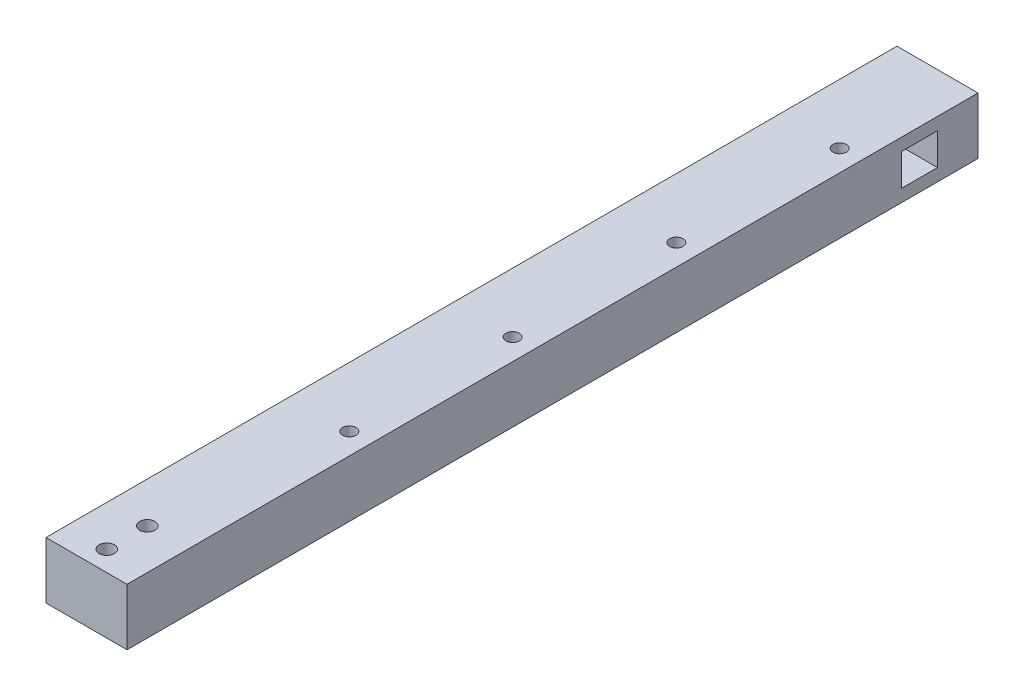
ISO-10303-21;
HEADER;
FILE_DESCRIPTION(('STEP AP214'),'2;1');
FILE_NAME('part.step','',(''),(''),'','','');
FILE_SCHEMA(('AUTOMOTIVE_DESIGN { 1 0 10303 214 1 1 1 1 }'));
ENDSEC;
DATA;
#1=APPLICATION_CONTEXT('core data for automotive mechanical design processes');
#2=APPLICATION_PROTOCOL_DEFINITION('international standard','automotive_design',2000,#1);
#3=PRODUCT_CONTEXT('',#1,'mechanical');
#4=PRODUCT('Part','Part','',(#3));
#5=PRODUCT_RELATED_PRODUCT_CATEGORY('part','',(#4));
#6=PRODUCT_DEFINITION_FORMATION('','',#4);
#7=PRODUCT_DEFINITION_CONTEXT('part definition',#1,'design');
#8=PRODUCT_DEFINITION('design','',#6,#7);
#9=PRODUCT_DEFINITION_SHAPE('','',#8);
#10=(LENGTH_UNIT() NAMED_UNIT(*) SI_UNIT(.MILLI.,.METRE.));
#11=(NAMED_UNIT(*) PLANE_ANGLE_UNIT() SI_UNIT($,.RADIAN.));
#12=(NAMED_UNIT(*) SI_UNIT($,.STERADIAN.) SOLID_ANGLE_UNIT());
#13=UNCERTAINTY_MEASURE_WITH_UNIT(LENGTH_MEASURE(1.E-05),#10,'distance_accuracy_value','');
#14=(GEOMETRIC_REPRESENTATION_CONTEXT(3) GLOBAL_UNCERTAINTY_ASSIGNED_CONTEXT((#13)) GLOBAL_UNIT_ASSIGNED_CONTEXT((#10,
#11,#12)) REPRESENTATION_CONTEXT('',''));
#15=CARTESIAN_POINT('',(0.,0.,0.));
#16=DIRECTION('',(0.,0.,1.));
#17=DIRECTION('',(1.,0.,0.));
#18=AXIS2_PLACEMENT_3D('',#15,#16,#17);
#19=CARTESIAN_POINT('',(6.35,4.445,66.675));
#20=DIRECTION('',(-1.,0.,0.));
#21=DIRECTION('',(0.,0.,1.));
#22=AXIS2_PLACEMENT_3D('',#19,#20,#21);
#23=PLANE('',#22);
#24=DIRECTION('',(0.,0.,1.));
#25=VECTOR('',#24,1.);
#26=CARTESIAN_POINT('',(6.35,2.5,-54.675));
#27=LINE('',#26,#25);
#28=CARTESIAN_POINT('',(6.35,2.5,-60.325));
#29=VERTEX_POINT('',#28);
#30=CARTESIAN_POINT('',(6.35,2.5,-54.675));
#31=VERTEX_POINT('',#30);
#32=EDGE_CURVE('E150',#29,#31,#27,.T.);
#33=ORIENTED_EDGE('',*,*,#32,.F.);
#34=DIRECTION('',(0.,1.,0.));
#35=VECTOR('',#34,1.);
#36=CARTESIAN_POINT('',(6.35,2.5,-60.325));
#37=LINE('',#36,#35);
#38=CARTESIAN_POINT('',(6.35,-2.5,-60.325));
#39=VERTEX_POINT('',#38);
#40=EDGE_CURVE('E62',#39,#29,#37,.T.);
#41=ORIENTED_EDGE('',*,*,#40,.F.);
#42=DIRECTION('',(0.,0.,-1.));
#43=VECTOR('',#42,1.);
#44=CARTESIAN_POINT('',(6.35,-2.5,-54.675));
#45=LINE('',#44,#43);
#46=CARTESIAN_POINT('',(6.35,-2.5,-54.675));
#47=VERTEX_POINT('',#46);
#48=EDGE_CURVE('E134',#47,#39,#45,.T.);
#49=ORIENTED_EDGE('',*,*,#48,.F.);
#50=DIRECTION('',(0.,-1.,0.));
#51=VECTOR('',#50,1.);
#52=CARTESIAN_POINT('',(6.35,2.5,-54.675));
#53=LINE('',#52,#51);
#54=EDGE_CURVE('E138',#31,#47,#53,.T.);
#55=ORIENTED_EDGE('',*,*,#54,.F.);
#56=EDGE_LOOP('',(#33,#41,#49,#55));
#57=FACE_BOUND('',#56,.T.);
#58=DIRECTION('',(0.,0.,-1.));
#59=VECTOR('',#58,1.);
#60=CARTESIAN_POINT('',(6.35,-4.445,66.675));
#61=LINE('',#60,#59);
#62=CARTESIAN_POINT('',(6.35,-4.445,66.675));
#63=VERTEX_POINT('',#62);
#64=CARTESIAN_POINT('',(6.35,-4.445,-66.675));
#65=VERTEX_POINT('',#64);
#66=EDGE_CURVE('E193',#63,#65,#61,.T.);
#67=ORIENTED_EDGE('',*,*,#66,.T.);
#68=DIRECTION('',(0.,-1.,0.));
#69=VECTOR('',#68,1.);
#70=CARTESIAN_POINT('',(6.35,4.445,-66.675));
#71=LINE('',#70,#69);
#72=CARTESIAN_POINT('',(6.35,4.445,-66.675));
#73=VERTEX_POINT('',#72);
#74=EDGE_CURVE('E11',#73,#65,#71,.T.);
#75=ORIENTED_EDGE('',*,*,#74,.F.);
#76=DIRECTION('',(0.,0.,-1.));
#77=VECTOR('',#76,1.);
#78=CARTESIAN_POINT('',(6.35,4.445,66.675));
#79=LINE('',#78,#77);
#80=CARTESIAN_POINT('',(6.35,4.445,66.675));
#81=VERTEX_POINT('',#80);
#82=EDGE_CURVE('E178',#81,#73,#79,.T.);
#83=ORIENTED_EDGE('',*,*,#82,.F.);
#84=DIRECTION('',(0.,-1.,0.));
#85=VECTOR('',#84,1.);
#86=CARTESIAN_POINT('',(6.35,4.445,66.675));
#87=LINE('',#86,#85);
#88=EDGE_CURVE('E192',#81,#63,#87,.T.);
#89=ORIENTED_EDGE('',*,*,#88,.T.);
#90=EDGE_LOOP('',(#67,#75,#83,#89));
#91=FACE_BOUND('',#90,.T.);
#92=ADVANCED_FACE('F45',(#57,#91),#23,.F.);
#93=CARTESIAN_POINT('',(-6.35,4.445,-66.675));
#94=DIRECTION('',(0.,0.,1.));
#95=DIRECTION('',(1.,0.,0.));
#96=AXIS2_PLACEMENT_3D('',#93,#94,#95);
#97=PLANE('',#96);
#98=CARTESIAN_POINT('',(0.,0.,-66.675));
#99=DIRECTION('',(0.,0.,-1.));
#100=DIRECTION('',(-1.,0.,0.));
#101=AXIS2_PLACEMENT_3D('',#98,#99,#100);
#102=CIRCLE('',#101,1.2);
#103=CARTESIAN_POINT('',(-1.2,0.,-66.675));
#104=VERTEX_POINT('',#103);
#105=EDGE_CURVE('E165',#104,#104,#102,.T.);
#106=ORIENTED_EDGE('',*,*,#105,.F.);
#107=EDGE_LOOP('',(#106));
#108=FACE_BOUND('',#107,.T.);
#109=DIRECTION('',(-1.,0.,0.));
#110=VECTOR('',#109,1.);
#111=CARTESIAN_POINT('',(-6.35,-4.445,-66.675));
#112=LINE('',#111,#110);
#113=CARTESIAN_POINT('',(-6.35,-4.445,-66.675));
#114=VERTEX_POINT('',#113);
#115=EDGE_CURVE('E197',#65,#114,#112,.T.);
#116=ORIENTED_EDGE('',*,*,#115,.T.);
#117=DIRECTION('',(0.,-1.,0.));
#118=VECTOR('',#117,1.);
#119=CARTESIAN_POINT('',(-6.35,4.445,-66.675));
#120=LINE('',#119,#118);
#121=CARTESIAN_POINT('',(-6.35,4.445,-66.675));
#122=VERTEX_POINT('',#121);
#123=EDGE_CURVE('E54',#122,#114,#120,.T.);
#124=ORIENTED_EDGE('',*,*,#123,.F.);
#125=DIRECTION('',(-1.,0.,0.));
#126=VECTOR('',#125,1.);
#127=CARTESIAN_POINT('',(-6.35,4.445,-66.675));
#128=LINE('',#127,#126);
#129=EDGE_CURVE('E182',#73,#122,#128,.T.);
#130=ORIENTED_EDGE('',*,*,#129,.F.);
#131=ORIENTED_EDGE('',*,*,#74,.T.);
#132=EDGE_LOOP('',(#116,#124,#130,#131));
#133=FACE_BOUND('',#132,.T.);
#134=ADVANCED_FACE('F248',(#108,#133),#97,.F.);
#135=CARTESIAN_POINT('',(-6.35,4.445,66.675));
#136=DIRECTION('',(1.,0.,0.));
#137=DIRECTION('',(0.,0.,-1.));
#138=AXIS2_PLACEMENT_3D('',#135,#136,#137);
#139=PLANE('',#138);
#140=DIRECTION('',(0.,0.,-1.));
#141=VECTOR('',#140,1.);
#142=CARTESIAN_POINT('',(-6.35,-2.5,-54.675));
#143=LINE('',#142,#141);
#144=CARTESIAN_POINT('',(-6.35,-2.5,-54.675));
#145=VERTEX_POINT('',#144);
#146=CARTESIAN_POINT('',(-6.35,-2.5,-60.325));
#147=VERTEX_POINT('',#146);
#148=EDGE_CURVE('E122',#145,#147,#143,.T.);
#149=ORIENTED_EDGE('',*,*,#148,.T.);
#150=DIRECTION('',(0.,1.,0.));
#151=VECTOR('',#150,1.);
#152=CARTESIAN_POINT('',(-6.35,2.5,-60.325));
#153=LINE('',#152,#151);
#154=CARTESIAN_POINT('',(-6.35,2.5,-60.325));
#155=VERTEX_POINT('',#154);
#156=EDGE_CURVE('E115',#147,#155,#153,.T.);
#157=ORIENTED_EDGE('',*,*,#156,.T.);
#158=DIRECTION('',(0.,0.,1.));
#159=VECTOR('',#158,1.);
#160=CARTESIAN_POINT('',(-6.35,2.5,-54.675));
#161=LINE('',#160,#159);
#162=CARTESIAN_POINT('',(-6.35,2.5,-54.675));
#163=VERTEX_POINT('',#162);
#164=EDGE_CURVE('E125',#155,#163,#161,.T.);
#165=ORIENTED_EDGE('',*,*,#164,.T.);
#166=DIRECTION('',(0.,-1.,0.));
#167=VECTOR('',#166,1.);
#168=CARTESIAN_POINT('',(-6.35,2.5,-54.675));
#169=LINE('',#168,#167);
#170=EDGE_CURVE('E70',#163,#145,#169,.T.);
#171=ORIENTED_EDGE('',*,*,#170,.T.);
#172=EDGE_LOOP('',(#149,#157,#165,#171));
#173=FACE_BOUND('',#172,.T.);
#174=DIRECTION('',(0.,0.,1.));
#175=VECTOR('',#174,1.);
#176=CARTESIAN_POINT('',(-6.35,-4.445,66.675));
#177=LINE('',#176,#175);
#178=CARTESIAN_POINT('',(-6.35,-4.445,66.675));
#179=VERTEX_POINT('',#178);
#180=EDGE_CURVE('E201',#114,#179,#177,.T.);
#181=ORIENTED_EDGE('',*,*,#180,.T.);
#182=DIRECTION('',(0.,-1.,0.));
#183=VECTOR('',#182,1.);
#184=CARTESIAN_POINT('',(-6.35,4.445,66.675));
#185=LINE('',#184,#183);
#186=CARTESIAN_POINT('',(-6.35,4.445,66.675));
#187=VERTEX_POINT('',#186);
#188=EDGE_CURVE('E209',#187,#179,#185,.T.);
#189=ORIENTED_EDGE('',*,*,#188,.F.);
#190=DIRECTION('',(0.,0.,1.));
#191=VECTOR('',#190,1.);
#192=CARTESIAN_POINT('',(-6.35,4.445,66.675));
#193=LINE('',#192,#191);
#194=EDGE_CURVE('E186',#122,#187,#193,.T.);
#195=ORIENTED_EDGE('',*,*,#194,.F.);
#196=ORIENTED_EDGE('',*,*,#123,.T.);
#197=EDGE_LOOP('',(#181,#189,#195,#196));
#198=FACE_BOUND('',#197,.T.);
#199=ADVANCED_FACE('F130',(#173,#198),#139,.F.);
#200=CARTESIAN_POINT('',(-6.35,4.445,66.675));
#201=DIRECTION('',(0.,0.,-1.));
#202=DIRECTION('',(-1.,0.,0.));
#203=AXIS2_PLACEMENT_3D('',#200,#201,#202);
#204=PLANE('',#203);
#205=DIRECTION('',(1.,0.,0.));
#206=VECTOR('',#205,1.);
#207=CARTESIAN_POINT('',(-6.35,-4.445,66.675));
#208=LINE('',#207,#206);
#209=EDGE_CURVE('E183',#179,#63,#208,.T.);
#210=ORIENTED_EDGE('',*,*,#209,.T.);
#211=ORIENTED_EDGE('',*,*,#88,.F.);
#212=DIRECTION('',(1.,0.,0.));
#213=VECTOR('',#212,1.);
#214=CARTESIAN_POINT('',(-6.35,4.445,66.675));
#215=LINE('',#214,#213);
#216=EDGE_CURVE('E189',#187,#81,#215,.T.);
#217=ORIENTED_EDGE('',*,*,#216,.F.);
#218=ORIENTED_EDGE('',*,*,#188,.T.);
#219=EDGE_LOOP('',(#210,#211,#217,#218));
#220=FACE_BOUND('',#219,.T.);
#221=ADVANCED_FACE('F243',(#220),#204,.F.);
#222=CARTESIAN_POINT('',(0.,4.445,0.));
#223=DIRECTION('',(0.,-1.,0.));
#224=DIRECTION('',(0.,0.,-1.));
#225=AXIS2_PLACEMENT_3D('',#222,#223,#224);
#226=PLANE('',#225);
#227=CARTESIAN_POINT('',(3.01569041831463,4.445,-48.3314961916647));
#228=DIRECTION('',(0.,-1.,0.));
#229=DIRECTION('',(0.,0.,-1.));
#230=AXIS2_PLACEMENT_3D('',#227,#228,#229);
#231=CIRCLE('',#230,1.05429477609712);
#232=CARTESIAN_POINT('',(3.01569041831463,4.445,-49.3857909677618));
#233=VERTEX_POINT('',#232);
#234=EDGE_CURVE('E151',#233,#233,#231,.T.);
#235=ORIENTED_EDGE('',*,*,#234,.T.);
#236=EDGE_LOOP('',(#235));
#237=FACE_BOUND('',#236,.T.);
#238=CARTESIAN_POINT('',(3.01569041831463,4.445,-22.7390064859443));
#239=DIRECTION('',(0.,-1.,0.));
#240=DIRECTION('',(0.,0.,-1.));
#241=AXIS2_PLACEMENT_3D('',#238,#239,#240);
#242=CIRCLE('',#241,1.05429477609712);
#243=CARTESIAN_POINT('',(3.01569041831463,4.445,-23.7933012620414));
#244=VERTEX_POINT('',#243);
#245=EDGE_CURVE('E420',#244,#244,#242,.T.);
#246=ORIENTED_EDGE('',*,*,#245,.T.);
#247=EDGE_LOOP('',(#246));
#248=FACE_BOUND('',#247,.T.);
#249=CARTESIAN_POINT('',(3.01569041831463,4.445,2.9185038083353));
#250=DIRECTION('',(0.,-1.,0.));
#251=DIRECTION('',(0.,0.,-1.));
#252=AXIS2_PLACEMENT_3D('',#249,#250,#251);
#253=CIRCLE('',#252,1.05429477609712);
#254=CARTESIAN_POINT('',(3.01569041831463,4.445,1.86420903223819));
#255=VERTEX_POINT('',#254);
#256=EDGE_CURVE('E430',#255,#255,#253,.T.);
#257=ORIENTED_EDGE('',*,*,#256,.T.);
#258=EDGE_LOOP('',(#257));
#259=FACE_BOUND('',#258,.T.);
#260=CARTESIAN_POINT('',(3.01569041831463,4.445,28.5109935140557));
#261=DIRECTION('',(0.,-1.,0.));
#262=DIRECTION('',(0.,0.,-1.));
#263=AXIS2_PLACEMENT_3D('',#260,#261,#262);
#264=CIRCLE('',#263,1.05429477609712);
#265=CARTESIAN_POINT('',(3.01569041831463,4.445,27.4566987379585));
#266=VERTEX_POINT('',#265);
#267=EDGE_CURVE('E141',#266,#266,#264,.T.);
#268=ORIENTED_EDGE('',*,*,#267,.T.);
#269=EDGE_LOOP('',(#268));
#270=FACE_BOUND('',#269,.T.);
#271=CARTESIAN_POINT('',(0.,4.445,57.15));
#272=DIRECTION('',(0.,-1.,0.));
#273=DIRECTION('',(0.,0.,-1.));
#274=AXIS2_PLACEMENT_3D('',#271,#272,#273);
#275=CIRCLE('',#274,1.2);
#276=CARTESIAN_POINT('',(0.,4.445,55.95));
#277=VERTEX_POINT('',#276);
#278=EDGE_CURVE('E170',#277,#277,#275,.T.);
#279=ORIENTED_EDGE('',*,*,#278,.T.);
#280=EDGE_LOOP('',(#279));
#281=FACE_BOUND('',#280,.T.);
#282=CARTESIAN_POINT('',(0.,4.445,63.5));
#283=DIRECTION('',(0.,-1.,0.));
#284=DIRECTION('',(0.,0.,-1.));
#285=AXIS2_PLACEMENT_3D('',#282,#283,#284);
#286=CIRCLE('',#285,1.2);
#287=CARTESIAN_POINT('',(0.,4.445,62.3));
#288=VERTEX_POINT('',#287);
#289=EDGE_CURVE('E169',#288,#288,#286,.T.);
#290=ORIENTED_EDGE('',*,*,#289,.T.);
#291=EDGE_LOOP('',(#290));
#292=FACE_BOUND('',#291,.T.);
#293=ORIENTED_EDGE('',*,*,#82,.T.);
#294=ORIENTED_EDGE('',*,*,#129,.T.);
#295=ORIENTED_EDGE('',*,*,#194,.T.);
#296=ORIENTED_EDGE('',*,*,#216,.T.);
#297=EDGE_LOOP('',(#293,#294,#295,#296));
#298=FACE_BOUND('',#297,.T.);
#299=ADVANCED_FACE('F229',(#237,#248,#259,#270,#281,#292,#298),#226,.F.);
#300=CARTESIAN_POINT('',(0.,-4.445,0.));
#301=DIRECTION('',(0.,-1.,0.));
#302=DIRECTION('',(0.,0.,-1.));
#303=AXIS2_PLACEMENT_3D('',#300,#301,#302);
#304=PLANE('',#303);
#305=CARTESIAN_POINT('',(3.01569041831463,-4.445,-48.3314961916647));
#306=DIRECTION('',(0.,-1.,0.));
#307=DIRECTION('',(0.,0.,-1.));
#308=AXIS2_PLACEMENT_3D('',#305,#306,#307);
#309=CIRCLE('',#308,1.05429477609712);
#310=CARTESIAN_POINT('',(3.01569041831463,-4.445,-49.3857909677618));
#311=VERTEX_POINT('',#310);
#312=EDGE_CURVE('E412',#311,#311,#309,.T.);
#313=ORIENTED_EDGE('',*,*,#312,.F.);
#314=EDGE_LOOP('',(#313));
#315=FACE_BOUND('',#314,.T.);
#316=CARTESIAN_POINT('',(3.01569041831463,-4.445,-22.7390064859443));
#317=DIRECTION('',(0.,-1.,0.));
#318=DIRECTION('',(0.,0.,-1.));
#319=AXIS2_PLACEMENT_3D('',#316,#317,#318);
#320=CIRCLE('',#319,1.05429477609712);
#321=CARTESIAN_POINT('',(3.01569041831463,-4.445,-23.7933012620414));
#322=VERTEX_POINT('',#321);
#323=EDGE_CURVE('E414',#322,#322,#320,.T.);
#324=ORIENTED_EDGE('',*,*,#323,.F.);
#325=EDGE_LOOP('',(#324));
#326=FACE_BOUND('',#325,.T.);
#327=CARTESIAN_POINT('',(3.01569041831463,-4.445,2.9185038083353));
#328=DIRECTION('',(0.,-1.,0.));
#329=DIRECTION('',(0.,0.,-1.));
#330=AXIS2_PLACEMENT_3D('',#327,#328,#329);
#331=CIRCLE('',#330,1.05429477609712);
#332=CARTESIAN_POINT('',(3.01569041831463,-4.445,1.86420903223819));
#333=VERTEX_POINT('',#332);
#334=EDGE_CURVE('E426',#333,#333,#331,.T.);
#335=ORIENTED_EDGE('',*,*,#334,.F.);
#336=EDGE_LOOP('',(#335));
#337=FACE_BOUND('',#336,.T.);
#338=CARTESIAN_POINT('',(3.01569041831463,-4.445,28.5109935140557));
#339=DIRECTION('',(0.,-1.,0.));
#340=DIRECTION('',(0.,0.,-1.));
#341=AXIS2_PLACEMENT_3D('',#338,#339,#340);
#342=CIRCLE('',#341,1.05429477609712);
#343=CARTESIAN_POINT('',(3.01569041831463,-4.445,27.4566987379585));
#344=VERTEX_POINT('',#343);
#345=EDGE_CURVE('E433',#344,#344,#342,.T.);
#346=ORIENTED_EDGE('',*,*,#345,.F.);
#347=EDGE_LOOP('',(#346));
#348=FACE_BOUND('',#347,.T.);
#349=CARTESIAN_POINT('',(0.,-4.445,57.15));
#350=DIRECTION('',(0.,-1.,0.));
#351=DIRECTION('',(0.,0.,-1.));
#352=AXIS2_PLACEMENT_3D('',#349,#350,#351);
#353=CIRCLE('',#352,1.2);
#354=CARTESIAN_POINT('',(0.,-4.445,55.95));
#355=VERTEX_POINT('',#354);
#356=EDGE_CURVE('E198',#355,#355,#353,.T.);
#357=ORIENTED_EDGE('',*,*,#356,.F.);
#358=EDGE_LOOP('',(#357));
#359=FACE_BOUND('',#358,.T.);
#360=CARTESIAN_POINT('',(0.,-4.445,63.5));
#361=DIRECTION('',(0.,-1.,0.));
#362=DIRECTION('',(0.,0.,-1.));
#363=AXIS2_PLACEMENT_3D('',#360,#361,#362);
#364=CIRCLE('',#363,1.2);
#365=CARTESIAN_POINT('',(0.,-4.445,62.3));
#366=VERTEX_POINT('',#365);
#367=EDGE_CURVE('E174',#366,#366,#364,.T.);
#368=ORIENTED_EDGE('',*,*,#367,.F.);
#369=EDGE_LOOP('',(#368));
#370=FACE_BOUND('',#369,.T.);
#371=ORIENTED_EDGE('',*,*,#66,.F.);
#372=ORIENTED_EDGE('',*,*,#209,.F.);
#373=ORIENTED_EDGE('',*,*,#180,.F.);
#374=ORIENTED_EDGE('',*,*,#115,.F.);
#375=EDGE_LOOP('',(#371,#372,#373,#374));
#376=FACE_BOUND('',#375,.T.);
#377=ADVANCED_FACE('F225',(#315,#326,#337,#348,#359,#370,#376),#304,.T.);
#378=CARTESIAN_POINT('',(0.,4.445,63.5));
#379=DIRECTION('',(0.,-1.,0.));
#380=DIRECTION('',(0.,0.,-1.));
#381=AXIS2_PLACEMENT_3D('',#378,#379,#380);
#382=CYLINDRICAL_SURFACE('',#381,1.2);
#383=ORIENTED_EDGE('',*,*,#367,.T.);
#384=EDGE_LOOP('',(#383));
#385=FACE_BOUND('',#384,.T.);
#386=ORIENTED_EDGE('',*,*,#289,.F.);
#387=EDGE_LOOP('',(#386));
#388=FACE_BOUND('',#387,.T.);
#389=ADVANCED_FACE('F228',(#385,#388),#382,.F.);
#390=CARTESIAN_POINT('',(0.,4.445,57.15));
#391=DIRECTION('',(0.,-1.,0.));
#392=DIRECTION('',(0.,0.,-1.));
#393=AXIS2_PLACEMENT_3D('',#390,#391,#392);
#394=CYLINDRICAL_SURFACE('',#393,1.2);
#395=ORIENTED_EDGE('',*,*,#356,.T.);
#396=EDGE_LOOP('',(#395));
#397=FACE_BOUND('',#396,.T.);
#398=ORIENTED_EDGE('',*,*,#278,.F.);
#399=EDGE_LOOP('',(#398));
#400=FACE_BOUND('',#399,.T.);
#401=ADVANCED_FACE('F222',(#397,#400),#394,.F.);
#402=CARTESIAN_POINT('',(0.,0.,-54.675));
#403=DIRECTION('',(0.,0.,-1.));
#404=DIRECTION('',(-1.,0.,0.));
#405=AXIS2_PLACEMENT_3D('',#402,#403,#404);
#406=CYLINDRICAL_SURFACE('',#405,1.2);
#407=CARTESIAN_POINT('',(0.,0.,-60.325));
#408=DIRECTION('',(0.,0.,-1.));
#409=DIRECTION('',(-1.,0.,0.));
#410=AXIS2_PLACEMENT_3D('',#407,#408,#409);
#411=CIRCLE('',#410,1.2);
#412=CARTESIAN_POINT('',(-1.2,0.,-60.325));
#413=VERTEX_POINT('',#412);
#414=EDGE_CURVE('E48',#413,#413,#411,.F.);
#415=ORIENTED_EDGE('',*,*,#414,.T.);
#416=EDGE_LOOP('',(#415));
#417=FACE_BOUND('',#416,.T.);
#418=ORIENTED_EDGE('',*,*,#105,.T.);
#419=EDGE_LOOP('',(#418));
#420=FACE_BOUND('',#419,.T.);
#421=ADVANCED_FACE('F280',(#417,#420),#406,.F.);
#422=CARTESIAN_POINT('',(-6.35,2.5,-60.325));
#423=DIRECTION('',(0.,0.,-1.));
#424=DIRECTION('',(-1.,0.,0.));
#425=AXIS2_PLACEMENT_3D('',#422,#423,#424);
#426=PLANE('',#425);
#427=ORIENTED_EDGE('',*,*,#40,.T.);
#428=DIRECTION('',(1.,0.,0.));
#429=VECTOR('',#428,1.);
#430=CARTESIAN_POINT('',(-6.35,2.5,-60.325));
#431=LINE('',#430,#429);
#432=EDGE_CURVE('E110',#155,#29,#431,.T.);
#433=ORIENTED_EDGE('',*,*,#432,.F.);
#434=ORIENTED_EDGE('',*,*,#156,.F.);
#435=DIRECTION('',(1.,0.,0.));
#436=VECTOR('',#435,1.);
#437=CARTESIAN_POINT('',(-6.35,-2.5,-60.325));
#438=LINE('',#437,#436);
#439=EDGE_CURVE('E157',#147,#39,#438,.T.);
#440=ORIENTED_EDGE('',*,*,#439,.T.);
#441=EDGE_LOOP('',(#427,#433,#434,#440));
#442=FACE_BOUND('',#441,.T.);
#443=ORIENTED_EDGE('',*,*,#414,.F.);
#444=EDGE_LOOP('',(#443));
#445=FACE_BOUND('',#444,.T.);
#446=ADVANCED_FACE('F112',(#442,#445),#426,.F.);
#447=CARTESIAN_POINT('',(-6.35,-2.5,-54.675));
#448=DIRECTION('',(0.,-1.,0.));
#449=DIRECTION('',(0.,0.,-1.));
#450=AXIS2_PLACEMENT_3D('',#447,#448,#449);
#451=PLANE('',#450);
#452=ORIENTED_EDGE('',*,*,#48,.T.);
#453=ORIENTED_EDGE('',*,*,#439,.F.);
#454=ORIENTED_EDGE('',*,*,#148,.F.);
#455=DIRECTION('',(1.,0.,0.));
#456=VECTOR('',#455,1.);
#457=CARTESIAN_POINT('',(-6.35,-2.5,-54.675));
#458=LINE('',#457,#456);
#459=EDGE_CURVE('E160',#145,#47,#458,.T.);
#460=ORIENTED_EDGE('',*,*,#459,.T.);
#461=EDGE_LOOP('',(#452,#453,#454,#460));
#462=FACE_BOUND('',#461,.T.);
#463=ADVANCED_FACE('F272',(#462),#451,.F.);
#464=CARTESIAN_POINT('',(-6.35,2.5,-54.675));
#465=DIRECTION('',(0.,1.,0.));
#466=DIRECTION('',(0.,0.,1.));
#467=AXIS2_PLACEMENT_3D('',#464,#465,#466);
#468=PLANE('',#467);
#469=ORIENTED_EDGE('',*,*,#32,.T.);
#470=DIRECTION('',(1.,0.,0.));
#471=VECTOR('',#470,1.);
#472=CARTESIAN_POINT('',(-6.35,2.5,-54.675));
#473=LINE('',#472,#471);
#474=EDGE_CURVE('E121',#163,#31,#473,.T.);
#475=ORIENTED_EDGE('',*,*,#474,.F.);
#476=ORIENTED_EDGE('',*,*,#164,.F.);
#477=ORIENTED_EDGE('',*,*,#432,.T.);
#478=EDGE_LOOP('',(#469,#475,#476,#477));
#479=FACE_BOUND('',#478,.T.);
#480=ADVANCED_FACE('F126',(#479),#468,.F.);
#481=CARTESIAN_POINT('',(0.,0.,-54.675));
#482=DIRECTION('',(0.,0.,-1.));
#483=DIRECTION('',(-1.,0.,0.));
#484=AXIS2_PLACEMENT_3D('',#481,#482,#483);
#485=PLANE('',#484);
#486=ORIENTED_EDGE('',*,*,#54,.T.);
#487=ORIENTED_EDGE('',*,*,#459,.F.);
#488=ORIENTED_EDGE('',*,*,#170,.F.);
#489=ORIENTED_EDGE('',*,*,#474,.T.);
#490=EDGE_LOOP('',(#486,#487,#488,#489));
#491=FACE_BOUND('',#490,.T.);
#492=ADVANCED_FACE('F270',(#491),#485,.T.);
#493=CARTESIAN_POINT('',(3.01569041831463,4.445,28.5109935140557));
#494=DIRECTION('',(0.,-1.,0.));
#495=DIRECTION('',(0.,0.,-1.));
#496=AXIS2_PLACEMENT_3D('',#493,#494,#495);
#497=CYLINDRICAL_SURFACE('',#496,1.05429477609712);
#498=ORIENTED_EDGE('',*,*,#267,.F.);
#499=EDGE_LOOP('',(#498));
#500=FACE_BOUND('',#499,.T.);
#501=ORIENTED_EDGE('',*,*,#345,.T.);
#502=EDGE_LOOP('',(#501));
#503=FACE_BOUND('',#502,.T.);
#504=ADVANCED_FACE('F283',(#500,#503),#497,.F.);
#505=CARTESIAN_POINT('',(3.01569041831463,4.445,2.9185038083353));
#506=DIRECTION('',(0.,-1.,0.));
#507=DIRECTION('',(0.,0.,-1.));
#508=AXIS2_PLACEMENT_3D('',#505,#506,#507);
#509=CYLINDRICAL_SURFACE('',#508,1.05429477609712);
#510=ORIENTED_EDGE('',*,*,#256,.F.);
#511=EDGE_LOOP('',(#510));
#512=FACE_BOUND('',#511,.T.);
#513=ORIENTED_EDGE('',*,*,#334,.T.);
#514=EDGE_LOOP('',(#513));
#515=FACE_BOUND('',#514,.T.);
#516=ADVANCED_FACE('F343',(#512,#515),#509,.F.);
#517=CARTESIAN_POINT('',(3.01569041831463,4.445,-22.7390064859443));
#518=DIRECTION('',(0.,-1.,0.));
#519=DIRECTION('',(0.,0.,-1.));
#520=AXIS2_PLACEMENT_3D('',#517,#518,#519);
#521=CYLINDRICAL_SURFACE('',#520,1.05429477609712);
#522=ORIENTED_EDGE('',*,*,#245,.F.);
#523=EDGE_LOOP('',(#522));
#524=FACE_BOUND('',#523,.T.);
#525=ORIENTED_EDGE('',*,*,#323,.T.);
#526=EDGE_LOOP('',(#525));
#527=FACE_BOUND('',#526,.T.);
#528=ADVANCED_FACE('F352',(#524,#527),#521,.F.);
#529=CARTESIAN_POINT('',(3.01569041831463,4.445,-48.3314961916647));
#530=DIRECTION('',(0.,-1.,0.));
#531=DIRECTION('',(0.,0.,-1.));
#532=AXIS2_PLACEMENT_3D('',#529,#530,#531);
#533=CYLINDRICAL_SURFACE('',#532,1.05429477609712);
#534=ORIENTED_EDGE('',*,*,#234,.F.);
#535=EDGE_LOOP('',(#534));
#536=FACE_BOUND('',#535,.T.);
#537=ORIENTED_EDGE('',*,*,#312,.T.);
#538=EDGE_LOOP('',(#537));
#539=FACE_BOUND('',#538,.T.);
#540=ADVANCED_FACE('F360',(#536,#539),#533,.F.);
#541=CLOSED_SHELL('',(#92,#134,#199,#221,#299,#377,#389,#401,#421,#446,#463,#480,#492,#504,#516,
#528,#540));
#542=MANIFOLD_SOLID_BREP('B2',#541);
#543=ADVANCED_BREP_SHAPE_REPRESENTATION('',(#18,#542),#14);
#544=SHAPE_DEFINITION_REPRESENTATION(#9,#543);
ENDSEC;
END-ISO-10303-21;
